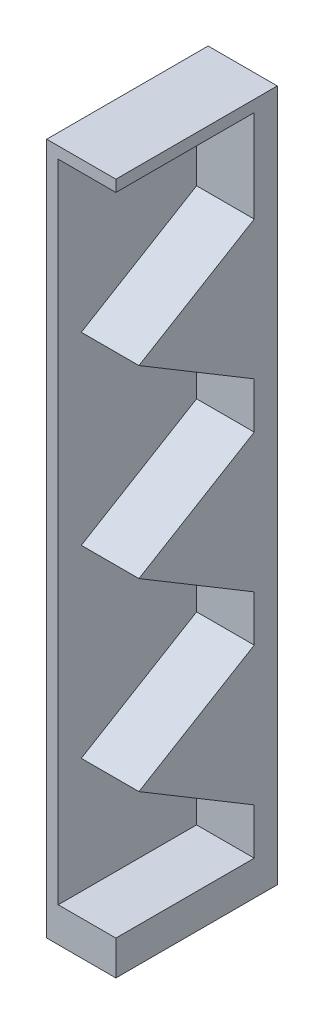
ISO-10303-21;
HEADER;
FILE_DESCRIPTION(('STEP AP214'),'2;1');
FILE_NAME('part.step','',(''),(''),'','','');
FILE_SCHEMA(('AUTOMOTIVE_DESIGN { 1 0 10303 214 1 1 1 1 }'));
ENDSEC;
DATA;
#1=APPLICATION_CONTEXT('core data for automotive mechanical design processes');
#2=APPLICATION_PROTOCOL_DEFINITION('international standard','automotive_design',2000,#1);
#3=PRODUCT_CONTEXT('',#1,'mechanical');
#4=PRODUCT('Part','Part','',(#3));
#5=PRODUCT_RELATED_PRODUCT_CATEGORY('part','',(#4));
#6=PRODUCT_DEFINITION_FORMATION('','',#4);
#7=PRODUCT_DEFINITION_CONTEXT('part definition',#1,'design');
#8=PRODUCT_DEFINITION('design','',#6,#7);
#9=PRODUCT_DEFINITION_SHAPE('','',#8);
#10=(LENGTH_UNIT() NAMED_UNIT(*) SI_UNIT(.MILLI.,.METRE.));
#11=(NAMED_UNIT(*) PLANE_ANGLE_UNIT() SI_UNIT($,.RADIAN.));
#12=(NAMED_UNIT(*) SI_UNIT($,.STERADIAN.) SOLID_ANGLE_UNIT());
#13=UNCERTAINTY_MEASURE_WITH_UNIT(LENGTH_MEASURE(1.E-05),#10,'distance_accuracy_value','');
#14=(GEOMETRIC_REPRESENTATION_CONTEXT(3) GLOBAL_UNCERTAINTY_ASSIGNED_CONTEXT((#13)) GLOBAL_UNIT_ASSIGNED_CONTEXT((#10,
#11,#12)) REPRESENTATION_CONTEXT('',''));
#15=CARTESIAN_POINT('',(0.,0.,0.));
#16=DIRECTION('',(0.,0.,1.));
#17=DIRECTION('',(1.,0.,0.));
#18=AXIS2_PLACEMENT_3D('',#15,#16,#17);
#19=CARTESIAN_POINT('',(-5.99706744868036,0.,0.));
#20=DIRECTION('',(1.,0.,0.));
#21=DIRECTION('',(0.,0.,-1.));
#22=AXIS2_PLACEMENT_3D('',#19,#20,#21);
#23=PLANE('',#22);
#24=DIRECTION('',(0.,-1.,0.));
#25=VECTOR('',#24,1.);
#26=CARTESIAN_POINT('',(-5.99706744868036,150.,24.633431085044));
#27=LINE('',#26,#25);
#28=CARTESIAN_POINT('',(-5.99706744868036,7.50000000000016,24.633431085044));
#29=VERTEX_POINT('',#28);
#30=CARTESIAN_POINT('',(-5.99706744868036,0.,24.633431085044));
#31=VERTEX_POINT('',#30);
#32=EDGE_CURVE('E243',#29,#31,#27,.T.);
#33=ORIENTED_EDGE('',*,*,#32,.T.);
#34=DIRECTION('',(0.,0.,-1.));
#35=VECTOR('',#34,1.);
#36=CARTESIAN_POINT('',(-5.99706744868036,0.,0.));
#37=LINE('',#36,#35);
#38=CARTESIAN_POINT('',(-5.99706744868036,0.,-10.366568914956));
#39=VERTEX_POINT('',#38);
#40=EDGE_CURVE('E237',#31,#39,#37,.T.);
#41=ORIENTED_EDGE('',*,*,#40,.T.);
#42=DIRECTION('',(0.,1.,0.));
#43=VECTOR('',#42,1.);
#44=CARTESIAN_POINT('',(-5.99706744868036,150.,-10.366568914956));
#45=LINE('',#44,#43);
#46=CARTESIAN_POINT('',(-5.99706744868036,150.,-10.366568914956));
#47=VERTEX_POINT('',#46);
#48=EDGE_CURVE('E240',#39,#47,#45,.T.);
#49=ORIENTED_EDGE('',*,*,#48,.T.);
#50=DIRECTION('',(0.,0.,-1.));
#51=VECTOR('',#50,1.);
#52=CARTESIAN_POINT('',(-5.99706744868036,150.,0.));
#53=LINE('',#52,#51);
#54=CARTESIAN_POINT('',(-5.99706744868036,150.,24.633431085044));
#55=VERTEX_POINT('',#54);
#56=EDGE_CURVE('E246',#55,#47,#53,.T.);
#57=ORIENTED_EDGE('',*,*,#56,.F.);
#58=CARTESIAN_POINT('',(-5.99706744868036,147.5,24.6334310850438));
#59=VERTEX_POINT('',#58);
#60=EDGE_CURVE('E245',#55,#59,#27,.T.);
#61=ORIENTED_EDGE('',*,*,#60,.T.);
#62=DIRECTION('',(0.,0.,1.));
#63=VECTOR('',#62,1.);
#64=CARTESIAN_POINT('',(-5.99706744868036,147.5,-5.36656891495616));
#65=LINE('',#64,#63);
#66=CARTESIAN_POINT('',(-5.99706744868036,147.5,-5.36656891495616));
#67=VERTEX_POINT('',#66);
#68=EDGE_CURVE('E257',#67,#59,#65,.T.);
#69=ORIENTED_EDGE('',*,*,#68,.F.);
#70=DIRECTION('',(0.,1.,0.));
#71=VECTOR('',#70,1.);
#72=CARTESIAN_POINT('',(-5.99706744868036,7.50000000000015,-5.36656891495602));
#73=LINE('',#72,#71);
#74=CARTESIAN_POINT('',(-5.99706744868035,127.5,-5.36656891495614));
#75=VERTEX_POINT('',#74);
#76=EDGE_CURVE('E227',#75,#67,#73,.T.);
#77=ORIENTED_EDGE('',*,*,#76,.F.);
#78=DIRECTION('',(0.,-0.514495755427526,0.857492925712545));
#79=VECTOR('',#78,1.);
#80=CARTESIAN_POINT('',(-5.99706744868035,112.5,19.6334310850439));
#81=LINE('',#80,#79);
#82=CARTESIAN_POINT('',(-5.99706744868035,112.5,19.6334310850439));
#83=VERTEX_POINT('',#82);
#84=EDGE_CURVE('E222',#75,#83,#81,.T.);
#85=ORIENTED_EDGE('',*,*,#84,.T.);
#86=DIRECTION('',(0.,-0.514495755427527,-0.857492925712544));
#87=VECTOR('',#86,1.);
#88=CARTESIAN_POINT('',(-5.99706744868035,97.5000000000001,-5.36656891495611));
#89=LINE('',#88,#87);
#90=CARTESIAN_POINT('',(-5.99706744868035,97.5000000000001,-5.36656891495611));
#91=VERTEX_POINT('',#90);
#92=EDGE_CURVE('E177',#83,#91,#89,.T.);
#93=ORIENTED_EDGE('',*,*,#92,.T.);
#94=DIRECTION('',(0.,1.,0.));
#95=VECTOR('',#94,1.);
#96=CARTESIAN_POINT('',(-5.99706744868036,7.50000000000015,-5.36656891495602));
#97=LINE('',#96,#95);
#98=CARTESIAN_POINT('',(-5.99706744868035,87.5000000000001,-5.3665689149561));
#99=VERTEX_POINT('',#98);
#100=EDGE_CURVE('E176',#99,#91,#97,.T.);
#101=ORIENTED_EDGE('',*,*,#100,.F.);
#102=DIRECTION('',(0.,-0.514495755427526,0.857492925712545));
#103=VECTOR('',#102,1.);
#104=CARTESIAN_POINT('',(-5.99706744868035,72.5000000000002,19.6334310850439));
#105=LINE('',#104,#103);
#106=CARTESIAN_POINT('',(-5.99706744868035,72.5000000000002,19.6334310850439));
#107=VERTEX_POINT('',#106);
#108=EDGE_CURVE('E162',#99,#107,#105,.T.);
#109=ORIENTED_EDGE('',*,*,#108,.T.);
#110=DIRECTION('',(0.,-0.514495755427527,-0.857492925712544));
#111=VECTOR('',#110,1.);
#112=CARTESIAN_POINT('',(-5.99706744868035,57.5000000000001,-5.36656891495607));
#113=LINE('',#112,#111);
#114=CARTESIAN_POINT('',(-5.99706744868035,57.5000000000001,-5.36656891495607));
#115=VERTEX_POINT('',#114);
#116=EDGE_CURVE('E173',#107,#115,#113,.T.);
#117=ORIENTED_EDGE('',*,*,#116,.T.);
#118=DIRECTION('',(0.,1.,0.));
#119=VECTOR('',#118,1.);
#120=CARTESIAN_POINT('',(-5.99706744868036,7.50000000000015,-5.36656891495602));
#121=LINE('',#120,#119);
#122=CARTESIAN_POINT('',(-5.99706744868035,47.5000000000001,-5.36656891495606));
#123=VERTEX_POINT('',#122);
#124=EDGE_CURVE('E249',#123,#115,#121,.T.);
#125=ORIENTED_EDGE('',*,*,#124,.F.);
#126=DIRECTION('',(0.,-0.514495755427526,0.857492925712545));
#127=VECTOR('',#126,1.);
#128=CARTESIAN_POINT('',(-5.99706744868035,32.5000000000002,19.633431085044));
#129=LINE('',#128,#127);
#130=CARTESIAN_POINT('',(-5.99706744868035,32.5000000000002,19.633431085044));
#131=VERTEX_POINT('',#130);
#132=EDGE_CURVE('E234',#123,#131,#129,.T.);
#133=ORIENTED_EDGE('',*,*,#132,.T.);
#134=DIRECTION('',(0.,-0.514495755427527,-0.857492925712544));
#135=VECTOR('',#134,1.);
#136=CARTESIAN_POINT('',(-5.99706744868035,17.5000000000001,-5.36656891495603));
#137=LINE('',#136,#135);
#138=CARTESIAN_POINT('',(-5.99706744868035,17.5000000000001,-5.36656891495603));
#139=VERTEX_POINT('',#138);
#140=EDGE_CURVE('E228',#131,#139,#137,.T.);
#141=ORIENTED_EDGE('',*,*,#140,.T.);
#142=DIRECTION('',(0.,1.,0.));
#143=VECTOR('',#142,1.);
#144=CARTESIAN_POINT('',(-5.99706744868036,7.50000000000015,-5.36656891495602));
#145=LINE('',#144,#143);
#146=CARTESIAN_POINT('',(-5.99706744868036,7.50000000000015,-5.36656891495602));
#147=VERTEX_POINT('',#146);
#148=EDGE_CURVE('E252',#147,#139,#145,.T.);
#149=ORIENTED_EDGE('',*,*,#148,.F.);
#150=DIRECTION('',(0.,0.,-1.));
#151=VECTOR('',#150,1.);
#152=CARTESIAN_POINT('',(-5.99706744868036,7.50000000000015,-5.36656891495602));
#153=LINE('',#152,#151);
#154=EDGE_CURVE('E255',#29,#147,#153,.T.);
#155=ORIENTED_EDGE('',*,*,#154,.F.);
#156=EDGE_LOOP('',(#33,#41,#49,#57,#61,#69,#77,#85,#93,#101,#109,#117,#125,#133,#141,#149,#155));
#157=FACE_BOUND('',#156,.T.);
#158=ADVANCED_FACE('F32',(#157),#23,.T.);
#159=CARTESIAN_POINT('',(-20.9970674486804,150.,24.633431085044));
#160=DIRECTION('',(0.,0.,-1.));
#161=DIRECTION('',(-1.,0.,0.));
#162=AXIS2_PLACEMENT_3D('',#159,#160,#161);
#163=PLANE('',#162);
#164=ORIENTED_EDGE('',*,*,#60,.F.);
#165=DIRECTION('',(1.,0.,0.));
#166=VECTOR('',#165,1.);
#167=CARTESIAN_POINT('',(-20.9970674486804,150.,24.633431085044));
#168=LINE('',#167,#166);
#169=CARTESIAN_POINT('',(-20.9970674486804,150.,24.633431085044));
#170=VERTEX_POINT('',#169);
#171=EDGE_CURVE('E185',#170,#55,#168,.T.);
#172=ORIENTED_EDGE('',*,*,#171,.F.);
#173=DIRECTION('',(0.,-1.,0.));
#174=VECTOR('',#173,1.);
#175=CARTESIAN_POINT('',(-20.9970674486804,150.,24.633431085044));
#176=LINE('',#175,#174);
#177=CARTESIAN_POINT('',(-20.9970674486804,0.,24.633431085044));
#178=VERTEX_POINT('',#177);
#179=EDGE_CURVE('E259',#170,#178,#176,.T.);
#180=ORIENTED_EDGE('',*,*,#179,.T.);
#181=DIRECTION('',(1.,0.,0.));
#182=VECTOR('',#181,1.);
#183=CARTESIAN_POINT('',(-20.9970674486804,0.,24.633431085044));
#184=LINE('',#183,#182);
#185=EDGE_CURVE('E192',#178,#31,#184,.T.);
#186=ORIENTED_EDGE('',*,*,#185,.T.);
#187=ORIENTED_EDGE('',*,*,#32,.F.);
#188=DIRECTION('',(1.,0.,0.));
#189=VECTOR('',#188,1.);
#190=CARTESIAN_POINT('',(-18.4970674486804,7.50000000000016,24.633431085044));
#191=LINE('',#190,#189);
#192=CARTESIAN_POINT('',(-18.4970674486804,7.50000000000016,24.633431085044));
#193=VERTEX_POINT('',#192);
#194=EDGE_CURVE('E198',#193,#29,#191,.T.);
#195=ORIENTED_EDGE('',*,*,#194,.F.);
#196=DIRECTION('',(0.,1.,0.));
#197=VECTOR('',#196,1.);
#198=CARTESIAN_POINT('',(-18.4970674486804,7.50000000000016,24.633431085044));
#199=LINE('',#198,#197);
#200=CARTESIAN_POINT('',(-18.4970674486804,147.5,24.6334310850438));
#201=VERTEX_POINT('',#200);
#202=EDGE_CURVE('E277',#193,#201,#199,.T.);
#203=ORIENTED_EDGE('',*,*,#202,.T.);
#204=DIRECTION('',(1.,0.,0.));
#205=VECTOR('',#204,1.);
#206=CARTESIAN_POINT('',(-18.4970674486804,147.5,24.6334310850438));
#207=LINE('',#206,#205);
#208=EDGE_CURVE('E201',#201,#59,#207,.T.);
#209=ORIENTED_EDGE('',*,*,#208,.T.);
#210=EDGE_LOOP('',(#164,#172,#180,#186,#187,#195,#203,#209));
#211=FACE_BOUND('',#210,.T.);
#212=ADVANCED_FACE('F291',(#211),#163,.F.);
#213=CARTESIAN_POINT('',(-20.9970674486804,150.,-10.366568914956));
#214=DIRECTION('',(0.,0.,1.));
#215=DIRECTION('',(1.,0.,0.));
#216=AXIS2_PLACEMENT_3D('',#213,#214,#215);
#217=PLANE('',#216);
#218=ORIENTED_EDGE('',*,*,#48,.F.);
#219=DIRECTION('',(-1.,0.,0.));
#220=VECTOR('',#219,1.);
#221=CARTESIAN_POINT('',(-20.9970674486804,0.,-10.366568914956));
#222=LINE('',#221,#220);
#223=CARTESIAN_POINT('',(-20.9970674486804,0.,-10.366568914956));
#224=VERTEX_POINT('',#223);
#225=EDGE_CURVE('E190',#39,#224,#222,.T.);
#226=ORIENTED_EDGE('',*,*,#225,.T.);
#227=DIRECTION('',(0.,-1.,0.));
#228=VECTOR('',#227,1.);
#229=CARTESIAN_POINT('',(-20.9970674486804,150.,-10.366568914956));
#230=LINE('',#229,#228);
#231=CARTESIAN_POINT('',(-20.9970674486804,150.,-10.366568914956));
#232=VERTEX_POINT('',#231);
#233=EDGE_CURVE('E186',#232,#224,#230,.T.);
#234=ORIENTED_EDGE('',*,*,#233,.F.);
#235=DIRECTION('',(-1.,0.,0.));
#236=VECTOR('',#235,1.);
#237=CARTESIAN_POINT('',(-20.9970674486804,150.,-10.366568914956));
#238=LINE('',#237,#236);
#239=EDGE_CURVE('E183',#47,#232,#238,.T.);
#240=ORIENTED_EDGE('',*,*,#239,.F.);
#241=EDGE_LOOP('',(#218,#226,#234,#240));
#242=FACE_BOUND('',#241,.T.);
#243=ADVANCED_FACE('F319',(#242),#217,.F.);
#244=CARTESIAN_POINT('',(0.,150.,0.));
#245=DIRECTION('',(0.,1.,0.));
#246=DIRECTION('',(0.,0.,1.));
#247=AXIS2_PLACEMENT_3D('',#244,#245,#246);
#248=PLANE('',#247);
#249=ORIENTED_EDGE('',*,*,#171,.T.);
#250=ORIENTED_EDGE('',*,*,#56,.T.);
#251=ORIENTED_EDGE('',*,*,#239,.T.);
#252=DIRECTION('',(0.,0.,1.));
#253=VECTOR('',#252,1.);
#254=CARTESIAN_POINT('',(-20.9970674486804,150.,-10.366568914956));
#255=LINE('',#254,#253);
#256=EDGE_CURVE('E189',#232,#170,#255,.T.);
#257=ORIENTED_EDGE('',*,*,#256,.T.);
#258=EDGE_LOOP('',(#249,#250,#251,#257));
#259=FACE_BOUND('',#258,.T.);
#260=ADVANCED_FACE('F34',(#259),#248,.T.);
#261=CARTESIAN_POINT('',(0.,0.,0.));
#262=DIRECTION('',(0.,1.,0.));
#263=DIRECTION('',(0.,0.,1.));
#264=AXIS2_PLACEMENT_3D('',#261,#262,#263);
#265=PLANE('',#264);
#266=ORIENTED_EDGE('',*,*,#40,.F.);
#267=ORIENTED_EDGE('',*,*,#185,.F.);
#268=DIRECTION('',(0.,0.,1.));
#269=VECTOR('',#268,1.);
#270=CARTESIAN_POINT('',(-20.9970674486804,0.,-10.366568914956));
#271=LINE('',#270,#269);
#272=EDGE_CURVE('E194',#224,#178,#271,.T.);
#273=ORIENTED_EDGE('',*,*,#272,.F.);
#274=ORIENTED_EDGE('',*,*,#225,.F.);
#275=EDGE_LOOP('',(#266,#267,#273,#274));
#276=FACE_BOUND('',#275,.T.);
#277=ADVANCED_FACE('F300',(#276),#265,.F.);
#278=CARTESIAN_POINT('',(-18.4970674486804,7.50000000000015,-5.36656891495602));
#279=DIRECTION('',(0.,0.,1.));
#280=DIRECTION('',(0.,1.,0.));
#281=AXIS2_PLACEMENT_3D('',#278,#279,#280);
#282=PLANE('',#281);
#283=DIRECTION('',(1.,0.,0.));
#284=VECTOR('',#283,1.);
#285=CARTESIAN_POINT('',(-57.5483158282136,87.5000000000001,-5.3665689149561));
#286=LINE('',#285,#284);
#287=CARTESIAN_POINT('',(-18.4970674486804,87.5000000000001,-5.3665689149561));
#288=VERTEX_POINT('',#287);
#289=EDGE_CURVE('E166',#288,#99,#286,.T.);
#290=ORIENTED_EDGE('',*,*,#289,.T.);
#291=ORIENTED_EDGE('',*,*,#100,.T.);
#292=DIRECTION('',(1.,0.,0.));
#293=VECTOR('',#292,1.);
#294=CARTESIAN_POINT('',(-57.5483158282136,97.5000000000001,-5.36656891495611));
#295=LINE('',#294,#293);
#296=CARTESIAN_POINT('',(-18.4970674486804,97.5000000000001,-5.36656891495611));
#297=VERTEX_POINT('',#296);
#298=EDGE_CURVE('E217',#297,#91,#295,.T.);
#299=ORIENTED_EDGE('',*,*,#298,.F.);
#300=DIRECTION('',(0.,-1.,0.));
#301=VECTOR('',#300,1.);
#302=CARTESIAN_POINT('',(-18.4970674486804,7.50000000000015,-5.36656891495602));
#303=LINE('',#302,#301);
#304=EDGE_CURVE('E273',#297,#288,#303,.T.);
#305=ORIENTED_EDGE('',*,*,#304,.T.);
#306=EDGE_LOOP('',(#290,#291,#299,#305));
#307=FACE_BOUND('',#306,.T.);
#308=ADVANCED_FACE('F330',(#307),#282,.T.);
#309=DIRECTION('',(1.,0.,0.));
#310=VECTOR('',#309,1.);
#311=CARTESIAN_POINT('',(-57.5483158282136,47.5000000000001,-5.36656891495606));
#312=LINE('',#311,#310);
#313=CARTESIAN_POINT('',(-18.4970674486804,47.5000000000001,-5.36656891495606));
#314=VERTEX_POINT('',#313);
#315=EDGE_CURVE('E213',#314,#123,#312,.T.);
#316=ORIENTED_EDGE('',*,*,#315,.T.);
#317=ORIENTED_EDGE('',*,*,#124,.T.);
#318=DIRECTION('',(1.,0.,0.));
#319=VECTOR('',#318,1.);
#320=CARTESIAN_POINT('',(-57.5483158282136,57.5000000000001,-5.36656891495607));
#321=LINE('',#320,#319);
#322=CARTESIAN_POINT('',(-18.4970674486804,57.5000000000001,-5.36656891495607));
#323=VERTEX_POINT('',#322);
#324=EDGE_CURVE('E65',#323,#115,#321,.T.);
#325=ORIENTED_EDGE('',*,*,#324,.F.);
#326=EDGE_CURVE('E275',#323,#314,#303,.T.);
#327=ORIENTED_EDGE('',*,*,#326,.T.);
#328=EDGE_LOOP('',(#316,#317,#325,#327));
#329=FACE_BOUND('',#328,.T.);
#330=ADVANCED_FACE('F333',(#329),#282,.T.);
#331=DIRECTION('',(1.,0.,0.));
#332=VECTOR('',#331,1.);
#333=CARTESIAN_POINT('',(-57.5483158282136,127.5,-5.36656891495614));
#334=LINE('',#333,#332);
#335=CARTESIAN_POINT('',(-18.4970674486804,127.5,-5.36656891495614));
#336=VERTEX_POINT('',#335);
#337=EDGE_CURVE('E11',#336,#75,#334,.T.);
#338=ORIENTED_EDGE('',*,*,#337,.T.);
#339=ORIENTED_EDGE('',*,*,#76,.T.);
#340=DIRECTION('',(1.,0.,0.));
#341=VECTOR('',#340,1.);
#342=CARTESIAN_POINT('',(-18.4970674486804,147.5,-5.36656891495616));
#343=LINE('',#342,#341);
#344=CARTESIAN_POINT('',(-18.4970674486804,147.5,-5.36656891495616));
#345=VERTEX_POINT('',#344);
#346=EDGE_CURVE('E204',#345,#67,#343,.T.);
#347=ORIENTED_EDGE('',*,*,#346,.F.);
#348=EDGE_CURVE('E270',#345,#336,#303,.T.);
#349=ORIENTED_EDGE('',*,*,#348,.T.);
#350=EDGE_LOOP('',(#338,#339,#347,#349));
#351=FACE_BOUND('',#350,.T.);
#352=ADVANCED_FACE('F372',(#351),#282,.T.);
#353=DIRECTION('',(1.,0.,0.));
#354=VECTOR('',#353,1.);
#355=CARTESIAN_POINT('',(-18.4970674486804,7.50000000000015,-5.36656891495602));
#356=LINE('',#355,#354);
#357=CARTESIAN_POINT('',(-18.4970674486804,7.50000000000015,-5.36656891495602));
#358=VERTEX_POINT('',#357);
#359=EDGE_CURVE('E195',#358,#147,#356,.T.);
#360=ORIENTED_EDGE('',*,*,#359,.T.);
#361=ORIENTED_EDGE('',*,*,#148,.T.);
#362=DIRECTION('',(1.,0.,0.));
#363=VECTOR('',#362,1.);
#364=CARTESIAN_POINT('',(-57.5483158282136,17.5000000000001,-5.36656891495603));
#365=LINE('',#364,#363);
#366=CARTESIAN_POINT('',(-18.4970674486804,17.5000000000001,-5.36656891495603));
#367=VERTEX_POINT('',#366);
#368=EDGE_CURVE('E208',#367,#139,#365,.T.);
#369=ORIENTED_EDGE('',*,*,#368,.F.);
#370=EDGE_CURVE('E267',#367,#358,#303,.T.);
#371=ORIENTED_EDGE('',*,*,#370,.T.);
#372=EDGE_LOOP('',(#360,#361,#369,#371));
#373=FACE_BOUND('',#372,.T.);
#374=ADVANCED_FACE('F335',(#373),#282,.T.);
#375=CARTESIAN_POINT('',(-18.4970674486804,7.50000000000015,-5.36656891495602));
#376=DIRECTION('',(0.,1.,0.));
#377=DIRECTION('',(0.,0.,-1.));
#378=AXIS2_PLACEMENT_3D('',#375,#376,#377);
#379=PLANE('',#378);
#380=ORIENTED_EDGE('',*,*,#194,.T.);
#381=ORIENTED_EDGE('',*,*,#154,.T.);
#382=ORIENTED_EDGE('',*,*,#359,.F.);
#383=DIRECTION('',(0.,0.,1.));
#384=VECTOR('',#383,1.);
#385=CARTESIAN_POINT('',(-18.4970674486804,7.50000000000015,-5.36656891495602));
#386=LINE('',#385,#384);
#387=EDGE_CURVE('E274',#358,#193,#386,.T.);
#388=ORIENTED_EDGE('',*,*,#387,.T.);
#389=EDGE_LOOP('',(#380,#381,#382,#388));
#390=FACE_BOUND('',#389,.T.);
#391=ADVANCED_FACE('F306',(#390),#379,.T.);
#392=CARTESIAN_POINT('',(-18.4970674486804,147.5,-5.36656891495616));
#393=DIRECTION('',(0.,-1.,0.));
#394=DIRECTION('',(0.,0.,1.));
#395=AXIS2_PLACEMENT_3D('',#392,#393,#394);
#396=PLANE('',#395);
#397=ORIENTED_EDGE('',*,*,#346,.T.);
#398=ORIENTED_EDGE('',*,*,#68,.T.);
#399=ORIENTED_EDGE('',*,*,#208,.F.);
#400=DIRECTION('',(0.,0.,-1.));
#401=VECTOR('',#400,1.);
#402=CARTESIAN_POINT('',(-18.4970674486804,147.5,-5.36656891495616));
#403=LINE('',#402,#401);
#404=EDGE_CURVE('E207',#201,#345,#403,.T.);
#405=ORIENTED_EDGE('',*,*,#404,.T.);
#406=EDGE_LOOP('',(#397,#398,#399,#405));
#407=FACE_BOUND('',#406,.T.);
#408=ADVANCED_FACE('F315',(#407),#396,.T.);
#409=CARTESIAN_POINT('',(-57.5483158282136,32.5000000000002,19.633431085044));
#410=DIRECTION('',(0.,-0.857492925712545,-0.514495755427526));
#411=DIRECTION('',(0.,-0.514495755427526,0.857492925712545));
#412=AXIS2_PLACEMENT_3D('',#409,#410,#411);
#413=PLANE('',#412);
#414=ORIENTED_EDGE('',*,*,#132,.F.);
#415=ORIENTED_EDGE('',*,*,#315,.F.);
#416=DIRECTION('',(0.,-0.514495755427526,0.857492925712545));
#417=VECTOR('',#416,1.);
#418=CARTESIAN_POINT('',(-18.4970674486804,32.5000000000002,19.633431085044));
#419=LINE('',#418,#417);
#420=CARTESIAN_POINT('',(-18.4970674486804,32.5000000000002,19.633431085044));
#421=VERTEX_POINT('',#420);
#422=EDGE_CURVE('E211',#314,#421,#419,.T.);
#423=ORIENTED_EDGE('',*,*,#422,.T.);
#424=DIRECTION('',(1.,0.,0.));
#425=VECTOR('',#424,1.);
#426=CARTESIAN_POINT('',(-57.5483158282136,32.5000000000002,19.633431085044));
#427=LINE('',#426,#425);
#428=EDGE_CURVE('E210',#421,#131,#427,.T.);
#429=ORIENTED_EDGE('',*,*,#428,.T.);
#430=EDGE_LOOP('',(#414,#415,#423,#429));
#431=FACE_BOUND('',#430,.T.);
#432=ADVANCED_FACE('F345',(#431),#413,.F.);
#433=CARTESIAN_POINT('',(-57.5483158282136,17.5000000000001,-5.36656891495603));
#434=DIRECTION('',(0.,0.857492925712544,-0.514495755427527));
#435=DIRECTION('',(0.,-0.514495755427527,-0.857492925712544));
#436=AXIS2_PLACEMENT_3D('',#433,#434,#435);
#437=PLANE('',#436);
#438=ORIENTED_EDGE('',*,*,#140,.F.);
#439=ORIENTED_EDGE('',*,*,#428,.F.);
#440=DIRECTION('',(0.,-0.514495755427527,-0.857492925712544));
#441=VECTOR('',#440,1.);
#442=CARTESIAN_POINT('',(-18.4970674486804,17.5000000000001,-5.36656891495603));
#443=LINE('',#442,#441);
#444=EDGE_CURVE('E264',#421,#367,#443,.T.);
#445=ORIENTED_EDGE('',*,*,#444,.T.);
#446=ORIENTED_EDGE('',*,*,#368,.T.);
#447=EDGE_LOOP('',(#438,#439,#445,#446));
#448=FACE_BOUND('',#447,.T.);
#449=ADVANCED_FACE('F342',(#448),#437,.F.);
#450=CARTESIAN_POINT('',(-57.5483158282136,112.5,19.6334310850439));
#451=DIRECTION('',(0.,-0.857492925712545,-0.514495755427526));
#452=DIRECTION('',(0.,-0.514495755427526,0.857492925712545));
#453=AXIS2_PLACEMENT_3D('',#450,#451,#452);
#454=PLANE('',#453);
#455=ORIENTED_EDGE('',*,*,#84,.F.);
#456=ORIENTED_EDGE('',*,*,#337,.F.);
#457=DIRECTION('',(0.,-0.514495755427526,0.857492925712545));
#458=VECTOR('',#457,1.);
#459=CARTESIAN_POINT('',(-18.4970674486804,112.5,19.6334310850439));
#460=LINE('',#459,#458);
#461=CARTESIAN_POINT('',(-18.4970674486804,112.5,19.6334310850439));
#462=VERTEX_POINT('',#461);
#463=EDGE_CURVE('E73',#336,#462,#460,.T.);
#464=ORIENTED_EDGE('',*,*,#463,.T.);
#465=DIRECTION('',(1.,0.,0.));
#466=VECTOR('',#465,1.);
#467=CARTESIAN_POINT('',(-57.5483158282136,112.5,19.6334310850439));
#468=LINE('',#467,#466);
#469=EDGE_CURVE('E41',#462,#83,#468,.T.);
#470=ORIENTED_EDGE('',*,*,#469,.T.);
#471=EDGE_LOOP('',(#455,#456,#464,#470));
#472=FACE_BOUND('',#471,.T.);
#473=ADVANCED_FACE('F221',(#472),#454,.F.);
#474=CARTESIAN_POINT('',(-57.5483158282136,97.5000000000001,-5.36656891495611));
#475=DIRECTION('',(0.,0.857492925712544,-0.514495755427527));
#476=DIRECTION('',(0.,-0.514495755427527,-0.857492925712544));
#477=AXIS2_PLACEMENT_3D('',#474,#475,#476);
#478=PLANE('',#477);
#479=ORIENTED_EDGE('',*,*,#92,.F.);
#480=ORIENTED_EDGE('',*,*,#469,.F.);
#481=DIRECTION('',(0.,-0.514495755427527,-0.857492925712544));
#482=VECTOR('',#481,1.);
#483=CARTESIAN_POINT('',(-18.4970674486804,97.5000000000001,-5.36656891495611));
#484=LINE('',#483,#482);
#485=EDGE_CURVE('E49',#462,#297,#484,.T.);
#486=ORIENTED_EDGE('',*,*,#485,.T.);
#487=ORIENTED_EDGE('',*,*,#298,.T.);
#488=EDGE_LOOP('',(#479,#480,#486,#487));
#489=FACE_BOUND('',#488,.T.);
#490=ADVANCED_FACE('F230',(#489),#478,.F.);
#491=CARTESIAN_POINT('',(-57.5483158282136,72.5000000000002,19.6334310850439));
#492=DIRECTION('',(0.,-0.857492925712545,-0.514495755427526));
#493=DIRECTION('',(0.,-0.514495755427526,0.857492925712545));
#494=AXIS2_PLACEMENT_3D('',#491,#492,#493);
#495=PLANE('',#494);
#496=ORIENTED_EDGE('',*,*,#108,.F.);
#497=ORIENTED_EDGE('',*,*,#289,.F.);
#498=DIRECTION('',(0.,-0.514495755427526,0.857492925712545));
#499=VECTOR('',#498,1.);
#500=CARTESIAN_POINT('',(-18.4970674486804,72.5000000000002,19.6334310850439));
#501=LINE('',#500,#499);
#502=CARTESIAN_POINT('',(-18.4970674486804,72.5000000000002,19.6334310850439));
#503=VERTEX_POINT('',#502);
#504=EDGE_CURVE('E163',#288,#503,#501,.T.);
#505=ORIENTED_EDGE('',*,*,#504,.T.);
#506=DIRECTION('',(1.,0.,0.));
#507=VECTOR('',#506,1.);
#508=CARTESIAN_POINT('',(-57.5483158282136,72.5000000000002,19.6334310850439));
#509=LINE('',#508,#507);
#510=EDGE_CURVE('E158',#503,#107,#509,.T.);
#511=ORIENTED_EDGE('',*,*,#510,.T.);
#512=EDGE_LOOP('',(#496,#497,#505,#511));
#513=FACE_BOUND('',#512,.T.);
#514=ADVANCED_FACE('F160',(#513),#495,.F.);
#515=CARTESIAN_POINT('',(-57.5483158282136,57.5000000000001,-5.36656891495607));
#516=DIRECTION('',(0.,0.857492925712544,-0.514495755427527));
#517=DIRECTION('',(0.,-0.514495755427527,-0.857492925712544));
#518=AXIS2_PLACEMENT_3D('',#515,#516,#517);
#519=PLANE('',#518);
#520=ORIENTED_EDGE('',*,*,#116,.F.);
#521=ORIENTED_EDGE('',*,*,#510,.F.);
#522=DIRECTION('',(0.,-0.514495755427527,-0.857492925712544));
#523=VECTOR('',#522,1.);
#524=CARTESIAN_POINT('',(-18.4970674486804,57.5000000000001,-5.36656891495607));
#525=LINE('',#524,#523);
#526=EDGE_CURVE('E69',#503,#323,#525,.T.);
#527=ORIENTED_EDGE('',*,*,#526,.T.);
#528=ORIENTED_EDGE('',*,*,#324,.T.);
#529=EDGE_LOOP('',(#520,#521,#527,#528));
#530=FACE_BOUND('',#529,.T.);
#531=ADVANCED_FACE('F179',(#530),#519,.F.);
#532=CARTESIAN_POINT('',(-20.9970674486804,150.,-10.366568914956));
#533=DIRECTION('',(1.,0.,0.));
#534=DIRECTION('',(0.,0.,-1.));
#535=AXIS2_PLACEMENT_3D('',#532,#533,#534);
#536=PLANE('',#535);
#537=ORIENTED_EDGE('',*,*,#272,.T.);
#538=ORIENTED_EDGE('',*,*,#179,.F.);
#539=ORIENTED_EDGE('',*,*,#256,.F.);
#540=ORIENTED_EDGE('',*,*,#233,.T.);
#541=EDGE_LOOP('',(#537,#538,#539,#540));
#542=FACE_BOUND('',#541,.T.);
#543=ADVANCED_FACE('F296',(#542),#536,.F.);
#544=CARTESIAN_POINT('',(-18.4970674486804,7.50000000000015,-5.36656891495602));
#545=DIRECTION('',(1.,0.,0.));
#546=DIRECTION('',(0.,1.,0.));
#547=AXIS2_PLACEMENT_3D('',#544,#545,#546);
#548=PLANE('',#547);
#549=ORIENTED_EDGE('',*,*,#504,.F.);
#550=ORIENTED_EDGE('',*,*,#304,.F.);
#551=ORIENTED_EDGE('',*,*,#485,.F.);
#552=ORIENTED_EDGE('',*,*,#463,.F.);
#553=ORIENTED_EDGE('',*,*,#348,.F.);
#554=ORIENTED_EDGE('',*,*,#404,.F.);
#555=ORIENTED_EDGE('',*,*,#202,.F.);
#556=ORIENTED_EDGE('',*,*,#387,.F.);
#557=ORIENTED_EDGE('',*,*,#370,.F.);
#558=ORIENTED_EDGE('',*,*,#444,.F.);
#559=ORIENTED_EDGE('',*,*,#422,.F.);
#560=ORIENTED_EDGE('',*,*,#326,.F.);
#561=ORIENTED_EDGE('',*,*,#526,.F.);
#562=EDGE_LOOP('',(#549,#550,#551,#552,#553,#554,#555,#556,#557,#558,#559,#560,#561));
#563=FACE_BOUND('',#562,.T.);
#564=ADVANCED_FACE('F312',(#563),#548,.T.);
#565=CLOSED_SHELL('',(#158,#212,#243,#260,#277,#308,#330,#352,#374,#391,#408,#432,#449,#473,
#490,#514,#531,#543,#564));
#566=MANIFOLD_SOLID_BREP('B2',#565);
#567=ADVANCED_BREP_SHAPE_REPRESENTATION('',(#18,#566),#14);
#568=SHAPE_DEFINITION_REPRESENTATION(#9,#567);
ENDSEC;
END-ISO-10303-21;
